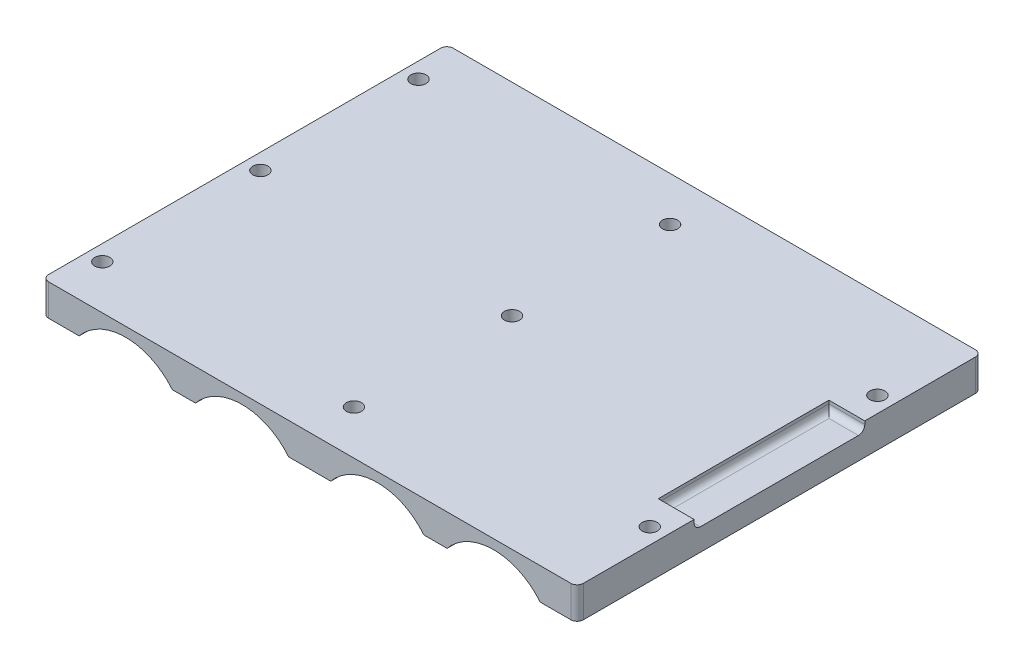
ISO-10303-21;
HEADER;
FILE_DESCRIPTION(('STEP AP214'),'2;1');
FILE_NAME('part.step','',(''),(''),'','','');
FILE_SCHEMA(('AUTOMOTIVE_DESIGN { 1 0 10303 214 1 1 1 1 }'));
ENDSEC;
DATA;
#1=APPLICATION_CONTEXT('core data for automotive mechanical design processes');
#2=APPLICATION_PROTOCOL_DEFINITION('international standard','automotive_design',2000,#1);
#3=PRODUCT_CONTEXT('',#1,'mechanical');
#4=PRODUCT('Part','Part','',(#3));
#5=PRODUCT_RELATED_PRODUCT_CATEGORY('part','',(#4));
#6=PRODUCT_DEFINITION_FORMATION('','',#4);
#7=PRODUCT_DEFINITION_CONTEXT('part definition',#1,'design');
#8=PRODUCT_DEFINITION('design','',#6,#7);
#9=PRODUCT_DEFINITION_SHAPE('','',#8);
#10=(LENGTH_UNIT() NAMED_UNIT(*) SI_UNIT(.MILLI.,.METRE.));
#11=(NAMED_UNIT(*) PLANE_ANGLE_UNIT() SI_UNIT($,.RADIAN.));
#12=(NAMED_UNIT(*) SI_UNIT($,.STERADIAN.) SOLID_ANGLE_UNIT());
#13=UNCERTAINTY_MEASURE_WITH_UNIT(LENGTH_MEASURE(1.E-05),#10,'distance_accuracy_value','');
#14=(GEOMETRIC_REPRESENTATION_CONTEXT(3) GLOBAL_UNCERTAINTY_ASSIGNED_CONTEXT((#13)) GLOBAL_UNIT_ASSIGNED_CONTEXT((#10,
#11,#12)) REPRESENTATION_CONTEXT('',''));
#15=CARTESIAN_POINT('',(0.,0.,0.));
#16=DIRECTION('',(0.,0.,1.));
#17=DIRECTION('',(1.,0.,0.));
#18=AXIS2_PLACEMENT_3D('',#15,#16,#17);
#19=CARTESIAN_POINT('',(3.33454006867188,-5.,32.));
#20=DIRECTION('',(0.,-1.,0.));
#21=DIRECTION('',(1.,0.,0.));
#22=AXIS2_PLACEMENT_3D('',#19,#20,#21);
#23=PLANE('',#22);
#24=CARTESIAN_POINT('',(0.,-5.,-25.));
#25=DIRECTION('',(0.,-1.,0.));
#26=DIRECTION('',(0.,0.,-1.));
#27=AXIS2_PLACEMENT_3D('',#24,#25,#26);
#28=CIRCLE('',#27,1.2);
#29=CARTESIAN_POINT('',(0.,-5.,-26.2));
#30=VERTEX_POINT('',#29);
#31=EDGE_CURVE('E216',#30,#30,#28,.T.);
#32=ORIENTED_EDGE('',*,*,#31,.F.);
#33=EDGE_LOOP('',(#32));
#34=FACE_BOUND('',#33,.T.);
#35=CARTESIAN_POINT('',(0.,-5.,0.));
#36=DIRECTION('',(0.,-1.,0.));
#37=DIRECTION('',(0.,0.,-1.));
#38=AXIS2_PLACEMENT_3D('',#35,#36,#37);
#39=CIRCLE('',#38,1.2);
#40=CARTESIAN_POINT('',(0.,-5.,-1.2));
#41=VERTEX_POINT('',#40);
#42=EDGE_CURVE('E224',#41,#41,#39,.T.);
#43=ORIENTED_EDGE('',*,*,#42,.F.);
#44=EDGE_LOOP('',(#43));
#45=FACE_BOUND('',#44,.T.);
#46=CARTESIAN_POINT('',(0.,-5.,25.));
#47=DIRECTION('',(0.,-1.,0.));
#48=DIRECTION('',(0.,0.,-1.));
#49=AXIS2_PLACEMENT_3D('',#46,#47,#48);
#50=CIRCLE('',#49,1.2);
#51=CARTESIAN_POINT('',(0.,-5.,23.8));
#52=VERTEX_POINT('',#51);
#53=EDGE_CURVE('E230',#52,#52,#50,.T.);
#54=ORIENTED_EDGE('',*,*,#53,.F.);
#55=EDGE_LOOP('',(#54));
#56=FACE_BOUND('',#55,.T.);
#57=DIRECTION('',(-1.,0.,0.));
#58=VECTOR('',#57,1.);
#59=CARTESIAN_POINT('',(3.33454006867188,-5.,-32.));
#60=LINE('',#59,#58);
#61=CARTESIAN_POINT('',(3.33454006867188,-5.,-32.));
#62=VERTEX_POINT('',#61);
#63=CARTESIAN_POINT('',(-3.33454006867188,-5.,-32.));
#64=VERTEX_POINT('',#63);
#65=EDGE_CURVE('E266',#62,#64,#60,.T.);
#66=ORIENTED_EDGE('',*,*,#65,.F.);
#67=DIRECTION('',(0.,0.,-1.));
#68=VECTOR('',#67,1.);
#69=CARTESIAN_POINT('',(3.33454006867188,-5.,32.));
#70=LINE('',#69,#68);
#71=CARTESIAN_POINT('',(3.33454006867188,-5.,32.));
#72=VERTEX_POINT('',#71);
#73=EDGE_CURVE('E321',#72,#62,#70,.T.);
#74=ORIENTED_EDGE('',*,*,#73,.F.);
#75=DIRECTION('',(-1.,0.,0.));
#76=VECTOR('',#75,1.);
#77=CARTESIAN_POINT('',(3.33454006867188,-5.,32.));
#78=LINE('',#77,#76);
#79=CARTESIAN_POINT('',(-3.33454006867188,-5.,32.));
#80=VERTEX_POINT('',#79);
#81=EDGE_CURVE('E267',#72,#80,#78,.T.);
#82=ORIENTED_EDGE('',*,*,#81,.T.);
#83=DIRECTION('',(0.,0.,-1.));
#84=VECTOR('',#83,1.);
#85=CARTESIAN_POINT('',(-3.33454006867188,-5.,32.));
#86=LINE('',#85,#84);
#87=EDGE_CURVE('E295',#80,#64,#86,.T.);
#88=ORIENTED_EDGE('',*,*,#87,.T.);
#89=EDGE_LOOP('',(#66,#74,#82,#88));
#90=FACE_BOUND('',#89,.T.);
#91=ADVANCED_FACE('F34',(#34,#45,#56,#90),#23,.T.);
#92=CARTESIAN_POINT('',(10.7,-11.,32.));
#93=DIRECTION('',(0.,0.,-1.));
#94=DIRECTION('',(-1.,0.,0.));
#95=AXIS2_PLACEMENT_3D('',#92,#93,#94);
#96=CYLINDRICAL_SURFACE('',#95,9.5);
#97=CARTESIAN_POINT('',(10.7,-11.,-32.));
#98=DIRECTION('',(0.,0.,-1.));
#99=DIRECTION('',(-1.,0.,0.));
#100=AXIS2_PLACEMENT_3D('',#97,#98,#99);
#101=CIRCLE('',#100,9.5);
#102=CARTESIAN_POINT('',(18.0654599313281,-5.,-32.));
#103=VERTEX_POINT('',#102);
#104=EDGE_CURVE('E271',#62,#103,#101,.T.);
#105=ORIENTED_EDGE('',*,*,#104,.T.);
#106=DIRECTION('',(0.,0.,-1.));
#107=VECTOR('',#106,1.);
#108=CARTESIAN_POINT('',(18.0654599313281,-5.,32.));
#109=LINE('',#108,#107);
#110=CARTESIAN_POINT('',(18.0654599313281,-5.,32.));
#111=VERTEX_POINT('',#110);
#112=EDGE_CURVE('E324',#111,#103,#109,.T.);
#113=ORIENTED_EDGE('',*,*,#112,.F.);
#114=CARTESIAN_POINT('',(10.7,-11.,32.));
#115=DIRECTION('',(0.,0.,-1.));
#116=DIRECTION('',(-1.,0.,0.));
#117=AXIS2_PLACEMENT_3D('',#114,#115,#116);
#118=CIRCLE('',#117,9.5);
#119=EDGE_CURVE('E293',#72,#111,#118,.T.);
#120=ORIENTED_EDGE('',*,*,#119,.F.);
#121=ORIENTED_EDGE('',*,*,#73,.T.);
#122=EDGE_LOOP('',(#105,#113,#120,#121));
#123=FACE_BOUND('',#122,.T.);
#124=ADVANCED_FACE('F422',(#123),#96,.F.);
#125=CARTESIAN_POINT('',(18.0654599313281,-5.,32.));
#126=DIRECTION('',(0.,1.,0.));
#127=DIRECTION('',(-1.,0.,0.));
#128=AXIS2_PLACEMENT_3D('',#125,#126,#127);
#129=PLANE('',#128);
#130=DIRECTION('',(1.,0.,0.));
#131=VECTOR('',#130,1.);
#132=CARTESIAN_POINT('',(18.0654599313281,-5.,-32.));
#133=LINE('',#132,#131);
#134=CARTESIAN_POINT('',(21.7345400686719,-5.,-32.));
#135=VERTEX_POINT('',#134);
#136=EDGE_CURVE('E318',#103,#135,#133,.T.);
#137=ORIENTED_EDGE('',*,*,#136,.T.);
#138=DIRECTION('',(0.,0.,-1.));
#139=VECTOR('',#138,1.);
#140=CARTESIAN_POINT('',(21.7345400686719,-5.,32.));
#141=LINE('',#140,#139);
#142=CARTESIAN_POINT('',(21.7345400686719,-5.,32.));
#143=VERTEX_POINT('',#142);
#144=EDGE_CURVE('E327',#143,#135,#141,.T.);
#145=ORIENTED_EDGE('',*,*,#144,.F.);
#146=DIRECTION('',(1.,0.,0.));
#147=VECTOR('',#146,1.);
#148=CARTESIAN_POINT('',(18.0654599313281,-5.,32.));
#149=LINE('',#148,#147);
#150=EDGE_CURVE('E291',#111,#143,#149,.T.);
#151=ORIENTED_EDGE('',*,*,#150,.F.);
#152=ORIENTED_EDGE('',*,*,#112,.T.);
#153=EDGE_LOOP('',(#137,#145,#151,#152));
#154=FACE_BOUND('',#153,.T.);
#155=ADVANCED_FACE('F428',(#154),#129,.F.);
#156=CARTESIAN_POINT('',(29.1,-11.,32.));
#157=DIRECTION('',(0.,0.,-1.));
#158=DIRECTION('',(-1.,0.,0.));
#159=AXIS2_PLACEMENT_3D('',#156,#157,#158);
#160=CYLINDRICAL_SURFACE('',#159,9.5);
#161=CARTESIAN_POINT('',(29.1,-11.,-32.));
#162=DIRECTION('',(0.,0.,-1.));
#163=DIRECTION('',(-1.,0.,0.));
#164=AXIS2_PLACEMENT_3D('',#161,#162,#163);
#165=CIRCLE('',#164,9.5);
#166=CARTESIAN_POINT('',(36.4654599313281,-5.,-32.));
#167=VERTEX_POINT('',#166);
#168=EDGE_CURVE('E316',#135,#167,#165,.T.);
#169=ORIENTED_EDGE('',*,*,#168,.T.);
#170=DIRECTION('',(0.,0.,-1.));
#171=VECTOR('',#170,1.);
#172=CARTESIAN_POINT('',(36.4654599313281,-5.,32.));
#173=LINE('',#172,#171);
#174=CARTESIAN_POINT('',(36.4654599313281,-5.,32.));
#175=VERTEX_POINT('',#174);
#176=EDGE_CURVE('E330',#175,#167,#173,.T.);
#177=ORIENTED_EDGE('',*,*,#176,.F.);
#178=CARTESIAN_POINT('',(29.1,-11.,32.));
#179=DIRECTION('',(0.,0.,-1.));
#180=DIRECTION('',(-1.,0.,0.));
#181=AXIS2_PLACEMENT_3D('',#178,#179,#180);
#182=CIRCLE('',#181,9.5);
#183=EDGE_CURVE('E289',#143,#175,#182,.T.);
#184=ORIENTED_EDGE('',*,*,#183,.F.);
#185=ORIENTED_EDGE('',*,*,#144,.T.);
#186=EDGE_LOOP('',(#169,#177,#184,#185));
#187=FACE_BOUND('',#186,.T.);
#188=ADVANCED_FACE('F472',(#187),#160,.F.);
#189=CARTESIAN_POINT('',(36.4654599313281,-5.,32.));
#190=DIRECTION('',(0.,1.,0.));
#191=DIRECTION('',(-1.,0.,0.));
#192=AXIS2_PLACEMENT_3D('',#189,#190,#191);
#193=PLANE('',#192);
#194=CARTESIAN_POINT('',(39.8,-5.,18.));
#195=DIRECTION('',(0.,-1.,0.));
#196=DIRECTION('',(0.,0.,-1.));
#197=AXIS2_PLACEMENT_3D('',#194,#195,#196);
#198=CIRCLE('',#197,1.2);
#199=CARTESIAN_POINT('',(39.8,-5.,16.8));
#200=VERTEX_POINT('',#199);
#201=EDGE_CURVE('E254',#200,#200,#198,.T.);
#202=ORIENTED_EDGE('',*,*,#201,.F.);
#203=EDGE_LOOP('',(#202));
#204=FACE_BOUND('',#203,.T.);
#205=CARTESIAN_POINT('',(39.8,-5.,-18.));
#206=DIRECTION('',(0.,-1.,0.));
#207=DIRECTION('',(0.,0.,-1.));
#208=AXIS2_PLACEMENT_3D('',#205,#206,#207);
#209=CIRCLE('',#208,1.2);
#210=CARTESIAN_POINT('',(39.8,-5.,-19.2));
#211=VERTEX_POINT('',#210);
#212=EDGE_CURVE('E260',#211,#211,#209,.T.);
#213=ORIENTED_EDGE('',*,*,#212,.F.);
#214=EDGE_LOOP('',(#213));
#215=FACE_BOUND('',#214,.T.);
#216=DIRECTION('',(1.,0.,0.));
#217=VECTOR('',#216,1.);
#218=CARTESIAN_POINT('',(36.4654599313281,-5.,-32.));
#219=LINE('',#218,#217);
#220=CARTESIAN_POINT('',(41.3,-5.,-32.));
#221=VERTEX_POINT('',#220);
#222=EDGE_CURVE('E313',#167,#221,#219,.T.);
#223=ORIENTED_EDGE('',*,*,#222,.T.);
#224=CARTESIAN_POINT('',(41.3,-5.,-31.));
#225=DIRECTION('',(0.,1.,0.));
#226=DIRECTION('',(-1.,0.,0.));
#227=AXIS2_PLACEMENT_3D('',#224,#225,#226);
#228=CIRCLE('',#227,1.);
#229=CARTESIAN_POINT('',(42.3,-5.,-31.));
#230=VERTEX_POINT('',#229);
#231=EDGE_CURVE('E380',#221,#230,#228,.F.);
#232=ORIENTED_EDGE('',*,*,#231,.T.);
#233=DIRECTION('',(0.,0.,-1.));
#234=VECTOR('',#233,1.);
#235=CARTESIAN_POINT('',(42.3,-5.,32.));
#236=LINE('',#235,#234);
#237=CARTESIAN_POINT('',(42.3,-5.,31.));
#238=VERTEX_POINT('',#237);
#239=EDGE_CURVE('E333',#238,#230,#236,.T.);
#240=ORIENTED_EDGE('',*,*,#239,.F.);
#241=CARTESIAN_POINT('',(41.3,-5.,31.));
#242=DIRECTION('',(0.,1.,0.));
#243=DIRECTION('',(-1.,0.,0.));
#244=AXIS2_PLACEMENT_3D('',#241,#242,#243);
#245=CIRCLE('',#244,1.);
#246=CARTESIAN_POINT('',(41.3,-5.,32.));
#247=VERTEX_POINT('',#246);
#248=EDGE_CURVE('E378',#238,#247,#245,.F.);
#249=ORIENTED_EDGE('',*,*,#248,.T.);
#250=DIRECTION('',(1.,0.,0.));
#251=VECTOR('',#250,1.);
#252=CARTESIAN_POINT('',(36.4654599313281,-5.,32.));
#253=LINE('',#252,#251);
#254=EDGE_CURVE('E286',#175,#247,#253,.T.);
#255=ORIENTED_EDGE('',*,*,#254,.F.);
#256=ORIENTED_EDGE('',*,*,#176,.T.);
#257=EDGE_LOOP('',(#223,#232,#240,#249,#255,#256));
#258=FACE_BOUND('',#257,.T.);
#259=ADVANCED_FACE('F463',(#204,#215,#258),#193,.F.);
#260=CARTESIAN_POINT('',(42.3,-5.,32.));
#261=DIRECTION('',(-1.,0.,0.));
#262=DIRECTION('',(0.,0.,1.));
#263=AXIS2_PLACEMENT_3D('',#260,#261,#262);
#264=PLANE('',#263);
#265=DIRECTION('',(0.,0.,-1.));
#266=VECTOR('',#265,1.);
#267=CARTESIAN_POINT('',(42.3,-1.5,13.5));
#268=LINE('',#267,#266);
#269=CARTESIAN_POINT('',(42.3,-1.5,12.5));
#270=VERTEX_POINT('',#269);
#271=CARTESIAN_POINT('',(42.3,-1.5,-12.5));
#272=VERTEX_POINT('',#271);
#273=EDGE_CURVE('E210',#270,#272,#268,.T.);
#274=ORIENTED_EDGE('',*,*,#273,.F.);
#275=CARTESIAN_POINT('',(42.3,-0.5,12.5));
#276=DIRECTION('',(-1.,0.,0.));
#277=DIRECTION('',(0.,0.,1.));
#278=AXIS2_PLACEMENT_3D('',#275,#276,#277);
#279=CIRCLE('',#278,1.);
#280=CARTESIAN_POINT('',(42.3,-0.5,13.5));
#281=VERTEX_POINT('',#280);
#282=EDGE_CURVE('E11',#270,#281,#279,.T.);
#283=ORIENTED_EDGE('',*,*,#282,.T.);
#284=DIRECTION('',(0.,1.,0.));
#285=VECTOR('',#284,1.);
#286=CARTESIAN_POINT('',(42.3,-1.5,13.5));
#287=LINE('',#286,#285);
#288=CARTESIAN_POINT('',(42.3,0.,13.5));
#289=VERTEX_POINT('',#288);
#290=EDGE_CURVE('E214',#281,#289,#287,.T.);
#291=ORIENTED_EDGE('',*,*,#290,.T.);
#292=DIRECTION('',(0.,0.,-1.));
#293=VECTOR('',#292,1.);
#294=CARTESIAN_POINT('',(42.3,0.,32.));
#295=LINE('',#294,#293);
#296=CARTESIAN_POINT('',(42.3,0.,31.));
#297=VERTEX_POINT('',#296);
#298=EDGE_CURVE('E336',#297,#289,#295,.T.);
#299=ORIENTED_EDGE('',*,*,#298,.F.);
#300=DIRECTION('',(0.,1.,0.));
#301=VECTOR('',#300,1.);
#302=CARTESIAN_POINT('',(42.3,-5.,31.));
#303=LINE('',#302,#301);
#304=EDGE_CURVE('E373',#297,#238,#303,.F.);
#305=ORIENTED_EDGE('',*,*,#304,.T.);
#306=ORIENTED_EDGE('',*,*,#239,.T.);
#307=DIRECTION('',(0.,1.,0.));
#308=VECTOR('',#307,1.);
#309=CARTESIAN_POINT('',(42.3,-5.,-31.));
#310=LINE('',#309,#308);
#311=CARTESIAN_POINT('',(42.3,0.,-31.));
#312=VERTEX_POINT('',#311);
#313=EDGE_CURVE('E375',#230,#312,#310,.T.);
#314=ORIENTED_EDGE('',*,*,#313,.T.);
#315=CARTESIAN_POINT('',(42.3,0.,-13.5));
#316=VERTEX_POINT('',#315);
#317=EDGE_CURVE('E338',#316,#312,#295,.T.);
#318=ORIENTED_EDGE('',*,*,#317,.F.);
#319=DIRECTION('',(0.,1.,0.));
#320=VECTOR('',#319,1.);
#321=CARTESIAN_POINT('',(42.3,-1.5,-13.5));
#322=LINE('',#321,#320);
#323=CARTESIAN_POINT('',(42.3,-0.5,-13.5));
#324=VERTEX_POINT('',#323);
#325=EDGE_CURVE('E195',#324,#316,#322,.T.);
#326=ORIENTED_EDGE('',*,*,#325,.F.);
#327=CARTESIAN_POINT('',(42.3,-0.5,-12.5));
#328=DIRECTION('',(-1.,0.,0.));
#329=DIRECTION('',(0.,0.,1.));
#330=AXIS2_PLACEMENT_3D('',#327,#328,#329);
#331=CIRCLE('',#330,1.);
#332=EDGE_CURVE('E43',#324,#272,#331,.T.);
#333=ORIENTED_EDGE('',*,*,#332,.T.);
#334=EDGE_LOOP('',(#274,#283,#291,#299,#305,#306,#314,#318,#326,#333));
#335=FACE_BOUND('',#334,.T.);
#336=ADVANCED_FACE('F412',(#335),#264,.F.);
#337=CARTESIAN_POINT('',(-42.3,0.,32.));
#338=DIRECTION('',(0.,1.,0.));
#339=DIRECTION('',(0.,0.,1.));
#340=AXIS2_PLACEMENT_3D('',#337,#338,#339);
#341=PLANE('',#340);
#342=DIRECTION('',(1.,0.,0.));
#343=VECTOR('',#342,1.);
#344=CARTESIAN_POINT('',(42.3,0.,13.5));
#345=LINE('',#344,#343);
#346=CARTESIAN_POINT('',(36.63,0.,13.5));
#347=VERTEX_POINT('',#346);
#348=EDGE_CURVE('E208',#347,#289,#345,.T.);
#349=ORIENTED_EDGE('',*,*,#348,.F.);
#350=DIRECTION('',(0.,0.,1.));
#351=VECTOR('',#350,1.);
#352=CARTESIAN_POINT('',(36.63,0.,13.5));
#353=LINE('',#352,#351);
#354=CARTESIAN_POINT('',(36.63,0.,-13.5));
#355=VERTEX_POINT('',#354);
#356=EDGE_CURVE('E188',#355,#347,#353,.T.);
#357=ORIENTED_EDGE('',*,*,#356,.F.);
#358=DIRECTION('',(-1.,0.,0.));
#359=VECTOR('',#358,1.);
#360=CARTESIAN_POINT('',(42.3,0.,-13.5));
#361=LINE('',#360,#359);
#362=EDGE_CURVE('E198',#316,#355,#361,.T.);
#363=ORIENTED_EDGE('',*,*,#362,.F.);
#364=ORIENTED_EDGE('',*,*,#317,.T.);
#365=CARTESIAN_POINT('',(41.3,0.,-31.));
#366=DIRECTION('',(0.,1.,0.));
#367=DIRECTION('',(0.,0.,1.));
#368=AXIS2_PLACEMENT_3D('',#365,#366,#367);
#369=CIRCLE('',#368,1.);
#370=CARTESIAN_POINT('',(41.3,0.,-32.));
#371=VERTEX_POINT('',#370);
#372=EDGE_CURVE('E360',#312,#371,#369,.T.);
#373=ORIENTED_EDGE('',*,*,#372,.T.);
#374=DIRECTION('',(1.,0.,0.));
#375=VECTOR('',#374,1.);
#376=CARTESIAN_POINT('',(-42.3,0.,-32.));
#377=LINE('',#376,#375);
#378=CARTESIAN_POINT('',(-41.3,0.,-32.));
#379=VERTEX_POINT('',#378);
#380=EDGE_CURVE('E310',#379,#371,#377,.T.);
#381=ORIENTED_EDGE('',*,*,#380,.F.);
#382=CARTESIAN_POINT('',(-41.3,0.,-31.));
#383=DIRECTION('',(0.,1.,0.));
#384=DIRECTION('',(0.,0.,1.));
#385=AXIS2_PLACEMENT_3D('',#382,#383,#384);
#386=CIRCLE('',#385,1.);
#387=CARTESIAN_POINT('',(-42.3,0.,-31.));
#388=VERTEX_POINT('',#387);
#389=EDGE_CURVE('E362',#379,#388,#386,.T.);
#390=ORIENTED_EDGE('',*,*,#389,.T.);
#391=DIRECTION('',(0.,0.,-1.));
#392=VECTOR('',#391,1.);
#393=CARTESIAN_POINT('',(-42.3,0.,32.));
#394=LINE('',#393,#392);
#395=CARTESIAN_POINT('',(-42.3,0.,31.));
#396=VERTEX_POINT('',#395);
#397=EDGE_CURVE('E339',#396,#388,#394,.T.);
#398=ORIENTED_EDGE('',*,*,#397,.F.);
#399=CARTESIAN_POINT('',(-41.3,0.,31.));
#400=DIRECTION('',(0.,1.,0.));
#401=DIRECTION('',(0.,0.,1.));
#402=AXIS2_PLACEMENT_3D('',#399,#400,#401);
#403=CIRCLE('',#402,1.);
#404=CARTESIAN_POINT('',(-41.3,0.,32.));
#405=VERTEX_POINT('',#404);
#406=EDGE_CURVE('E358',#396,#405,#403,.T.);
#407=ORIENTED_EDGE('',*,*,#406,.T.);
#408=DIRECTION('',(1.,0.,0.));
#409=VECTOR('',#408,1.);
#410=CARTESIAN_POINT('',(-42.3,0.,32.));
#411=LINE('',#410,#409);
#412=CARTESIAN_POINT('',(41.3,0.,32.));
#413=VERTEX_POINT('',#412);
#414=EDGE_CURVE('E283',#405,#413,#411,.T.);
#415=ORIENTED_EDGE('',*,*,#414,.T.);
#416=CARTESIAN_POINT('',(41.3,0.,31.));
#417=DIRECTION('',(0.,1.,0.));
#418=DIRECTION('',(0.,0.,1.));
#419=AXIS2_PLACEMENT_3D('',#416,#417,#418);
#420=CIRCLE('',#419,1.);
#421=EDGE_CURVE('E356',#413,#297,#420,.T.);
#422=ORIENTED_EDGE('',*,*,#421,.T.);
#423=ORIENTED_EDGE('',*,*,#298,.T.);
#424=EDGE_LOOP('',(#349,#357,#363,#364,#373,#381,#390,#398,#407,#415,#422,#423));
#425=FACE_BOUND('',#424,.T.);
#426=CARTESIAN_POINT('',(0.,0.,-25.));
#427=DIRECTION('',(0.,-1.,0.));
#428=DIRECTION('',(0.,0.,-1.));
#429=AXIS2_PLACEMENT_3D('',#426,#427,#428);
#430=CIRCLE('',#429,1.2);
#431=CARTESIAN_POINT('',(0.,0.,-26.2));
#432=VERTEX_POINT('',#431);
#433=EDGE_CURVE('E221',#432,#432,#430,.T.);
#434=ORIENTED_EDGE('',*,*,#433,.T.);
#435=EDGE_LOOP('',(#434));
#436=FACE_BOUND('',#435,.T.);
#437=CARTESIAN_POINT('',(0.,0.,0.));
#438=DIRECTION('',(0.,-1.,0.));
#439=DIRECTION('',(0.,0.,-1.));
#440=AXIS2_PLACEMENT_3D('',#437,#438,#439);
#441=CIRCLE('',#440,1.2);
#442=CARTESIAN_POINT('',(0.,0.,-1.2));
#443=VERTEX_POINT('',#442);
#444=EDGE_CURVE('E227',#443,#443,#441,.T.);
#445=ORIENTED_EDGE('',*,*,#444,.T.);
#446=EDGE_LOOP('',(#445));
#447=FACE_BOUND('',#446,.T.);
#448=CARTESIAN_POINT('',(0.,0.,25.));
#449=DIRECTION('',(0.,-1.,0.));
#450=DIRECTION('',(0.,0.,-1.));
#451=AXIS2_PLACEMENT_3D('',#448,#449,#450);
#452=CIRCLE('',#451,1.2);
#453=CARTESIAN_POINT('',(0.,0.,23.8));
#454=VERTEX_POINT('',#453);
#455=EDGE_CURVE('E233',#454,#454,#452,.T.);
#456=ORIENTED_EDGE('',*,*,#455,.T.);
#457=EDGE_LOOP('',(#456));
#458=FACE_BOUND('',#457,.T.);
#459=CARTESIAN_POINT('',(-39.8,0.,25.));
#460=DIRECTION('',(0.,-1.,0.));
#461=DIRECTION('',(0.,0.,-1.));
#462=AXIS2_PLACEMENT_3D('',#459,#460,#461);
#463=CIRCLE('',#462,1.2);
#464=CARTESIAN_POINT('',(-39.8,0.,23.8));
#465=VERTEX_POINT('',#464);
#466=EDGE_CURVE('E239',#465,#465,#463,.T.);
#467=ORIENTED_EDGE('',*,*,#466,.T.);
#468=EDGE_LOOP('',(#467));
#469=FACE_BOUND('',#468,.T.);
#470=CARTESIAN_POINT('',(-39.8,0.,0.));
#471=DIRECTION('',(0.,-1.,0.));
#472=DIRECTION('',(0.,0.,-1.));
#473=AXIS2_PLACEMENT_3D('',#470,#471,#472);
#474=CIRCLE('',#473,1.2);
#475=CARTESIAN_POINT('',(-39.8,0.,-1.2));
#476=VERTEX_POINT('',#475);
#477=EDGE_CURVE('E245',#476,#476,#474,.T.);
#478=ORIENTED_EDGE('',*,*,#477,.T.);
#479=EDGE_LOOP('',(#478));
#480=FACE_BOUND('',#479,.T.);
#481=CARTESIAN_POINT('',(-39.8,0.,-25.));
#482=DIRECTION('',(0.,-1.,0.));
#483=DIRECTION('',(0.,0.,-1.));
#484=AXIS2_PLACEMENT_3D('',#481,#482,#483);
#485=CIRCLE('',#484,1.2);
#486=CARTESIAN_POINT('',(-39.8,0.,-26.2));
#487=VERTEX_POINT('',#486);
#488=EDGE_CURVE('E251',#487,#487,#485,.T.);
#489=ORIENTED_EDGE('',*,*,#488,.T.);
#490=EDGE_LOOP('',(#489));
#491=FACE_BOUND('',#490,.T.);
#492=CARTESIAN_POINT('',(39.8,0.,18.));
#493=DIRECTION('',(0.,-1.,0.));
#494=DIRECTION('',(0.,0.,-1.));
#495=AXIS2_PLACEMENT_3D('',#492,#493,#494);
#496=CIRCLE('',#495,1.2);
#497=CARTESIAN_POINT('',(39.8,0.,16.8));
#498=VERTEX_POINT('',#497);
#499=EDGE_CURVE('E257',#498,#498,#496,.T.);
#500=ORIENTED_EDGE('',*,*,#499,.T.);
#501=EDGE_LOOP('',(#500));
#502=FACE_BOUND('',#501,.T.);
#503=CARTESIAN_POINT('',(39.8,0.,-18.));
#504=DIRECTION('',(0.,-1.,0.));
#505=DIRECTION('',(0.,0.,-1.));
#506=AXIS2_PLACEMENT_3D('',#503,#504,#505);
#507=CIRCLE('',#506,1.2);
#508=CARTESIAN_POINT('',(39.8,0.,-19.2));
#509=VERTEX_POINT('',#508);
#510=EDGE_CURVE('E263',#509,#509,#507,.T.);
#511=ORIENTED_EDGE('',*,*,#510,.T.);
#512=EDGE_LOOP('',(#511));
#513=FACE_BOUND('',#512,.T.);
#514=ADVANCED_FACE('F204',(#425,#436,#447,#458,#469,#480,#491,#502,#513),#341,.T.);
#515=CARTESIAN_POINT('',(-42.3,-5.,32.));
#516=DIRECTION('',(-1.,0.,0.));
#517=DIRECTION('',(0.,0.,1.));
#518=AXIS2_PLACEMENT_3D('',#515,#516,#517);
#519=PLANE('',#518);
#520=ORIENTED_EDGE('',*,*,#397,.T.);
#521=DIRECTION('',(0.,1.,0.));
#522=VECTOR('',#521,1.);
#523=CARTESIAN_POINT('',(-42.3,-5.,-31.));
#524=LINE('',#523,#522);
#525=CARTESIAN_POINT('',(-42.3,-5.,-31.));
#526=VERTEX_POINT('',#525);
#527=EDGE_CURVE('E367',#388,#526,#524,.F.);
#528=ORIENTED_EDGE('',*,*,#527,.T.);
#529=DIRECTION('',(0.,0.,-1.));
#530=VECTOR('',#529,1.);
#531=CARTESIAN_POINT('',(-42.3,-5.,32.));
#532=LINE('',#531,#530);
#533=CARTESIAN_POINT('',(-42.3,-5.,31.));
#534=VERTEX_POINT('',#533);
#535=EDGE_CURVE('E342',#534,#526,#532,.T.);
#536=ORIENTED_EDGE('',*,*,#535,.F.);
#537=DIRECTION('',(0.,1.,0.));
#538=VECTOR('',#537,1.);
#539=CARTESIAN_POINT('',(-42.3,-5.,31.));
#540=LINE('',#539,#538);
#541=EDGE_CURVE('E364',#534,#396,#540,.T.);
#542=ORIENTED_EDGE('',*,*,#541,.T.);
#543=EDGE_LOOP('',(#520,#528,#536,#542));
#544=FACE_BOUND('',#543,.T.);
#545=ADVANCED_FACE('F494',(#544),#519,.T.);
#546=CARTESIAN_POINT('',(-36.4654599313281,-5.,32.));
#547=DIRECTION('',(0.,-1.,0.));
#548=DIRECTION('',(1.,0.,0.));
#549=AXIS2_PLACEMENT_3D('',#546,#547,#548);
#550=PLANE('',#549);
#551=CARTESIAN_POINT('',(-39.8,-5.,25.));
#552=DIRECTION('',(0.,-1.,0.));
#553=DIRECTION('',(0.,0.,-1.));
#554=AXIS2_PLACEMENT_3D('',#551,#552,#553);
#555=CIRCLE('',#554,1.2);
#556=CARTESIAN_POINT('',(-39.8,-5.,23.8));
#557=VERTEX_POINT('',#556);
#558=EDGE_CURVE('E236',#557,#557,#555,.T.);
#559=ORIENTED_EDGE('',*,*,#558,.F.);
#560=EDGE_LOOP('',(#559));
#561=FACE_BOUND('',#560,.T.);
#562=CARTESIAN_POINT('',(-39.8,-5.,0.));
#563=DIRECTION('',(0.,-1.,0.));
#564=DIRECTION('',(0.,0.,-1.));
#565=AXIS2_PLACEMENT_3D('',#562,#563,#564);
#566=CIRCLE('',#565,1.2);
#567=CARTESIAN_POINT('',(-39.8,-5.,-1.2));
#568=VERTEX_POINT('',#567);
#569=EDGE_CURVE('E242',#568,#568,#566,.T.);
#570=ORIENTED_EDGE('',*,*,#569,.F.);
#571=EDGE_LOOP('',(#570));
#572=FACE_BOUND('',#571,.T.);
#573=CARTESIAN_POINT('',(-39.8,-5.,-25.));
#574=DIRECTION('',(0.,-1.,0.));
#575=DIRECTION('',(0.,0.,-1.));
#576=AXIS2_PLACEMENT_3D('',#573,#574,#575);
#577=CIRCLE('',#576,1.2);
#578=CARTESIAN_POINT('',(-39.8,-5.,-26.2));
#579=VERTEX_POINT('',#578);
#580=EDGE_CURVE('E248',#579,#579,#577,.T.);
#581=ORIENTED_EDGE('',*,*,#580,.F.);
#582=EDGE_LOOP('',(#581));
#583=FACE_BOUND('',#582,.T.);
#584=ORIENTED_EDGE('',*,*,#535,.T.);
#585=CARTESIAN_POINT('',(-41.3,-5.,-31.));
#586=DIRECTION('',(0.,-1.,0.));
#587=DIRECTION('',(1.,0.,0.));
#588=AXIS2_PLACEMENT_3D('',#585,#586,#587);
#589=CIRCLE('',#588,1.);
#590=CARTESIAN_POINT('',(-41.3,-5.,-32.));
#591=VERTEX_POINT('',#590);
#592=EDGE_CURVE('E371',#526,#591,#589,.T.);
#593=ORIENTED_EDGE('',*,*,#592,.T.);
#594=DIRECTION('',(-1.,0.,0.));
#595=VECTOR('',#594,1.);
#596=CARTESIAN_POINT('',(-36.4654599313281,-5.,-32.));
#597=LINE('',#596,#595);
#598=CARTESIAN_POINT('',(-36.4654599313281,-5.,-32.));
#599=VERTEX_POINT('',#598);
#600=EDGE_CURVE('E307',#599,#591,#597,.T.);
#601=ORIENTED_EDGE('',*,*,#600,.F.);
#602=DIRECTION('',(0.,0.,-1.));
#603=VECTOR('',#602,1.);
#604=CARTESIAN_POINT('',(-36.4654599313281,-5.,32.));
#605=LINE('',#604,#603);
#606=CARTESIAN_POINT('',(-36.4654599313281,-5.,32.));
#607=VERTEX_POINT('',#606);
#608=EDGE_CURVE('E345',#607,#599,#605,.T.);
#609=ORIENTED_EDGE('',*,*,#608,.F.);
#610=DIRECTION('',(-1.,0.,0.));
#611=VECTOR('',#610,1.);
#612=CARTESIAN_POINT('',(-36.4654599313281,-5.,32.));
#613=LINE('',#612,#611);
#614=CARTESIAN_POINT('',(-41.3,-5.,32.));
#615=VERTEX_POINT('',#614);
#616=EDGE_CURVE('E280',#607,#615,#613,.T.);
#617=ORIENTED_EDGE('',*,*,#616,.T.);
#618=CARTESIAN_POINT('',(-41.3,-5.,31.));
#619=DIRECTION('',(0.,-1.,0.));
#620=DIRECTION('',(1.,0.,0.));
#621=AXIS2_PLACEMENT_3D('',#618,#619,#620);
#622=CIRCLE('',#621,1.);
#623=EDGE_CURVE('E369',#615,#534,#622,.T.);
#624=ORIENTED_EDGE('',*,*,#623,.T.);
#625=EDGE_LOOP('',(#584,#593,#601,#609,#617,#624));
#626=FACE_BOUND('',#625,.T.);
#627=ADVANCED_FACE('F491',(#561,#572,#583,#626),#550,.T.);
#628=CARTESIAN_POINT('',(-29.1,-11.,32.));
#629=DIRECTION('',(0.,0.,-1.));
#630=DIRECTION('',(-1.,0.,0.));
#631=AXIS2_PLACEMENT_3D('',#628,#629,#630);
#632=CYLINDRICAL_SURFACE('',#631,9.50000000000001);
#633=CARTESIAN_POINT('',(-29.1,-11.,-32.));
#634=DIRECTION('',(0.,0.,1.));
#635=DIRECTION('',(1.,0.,0.));
#636=AXIS2_PLACEMENT_3D('',#633,#634,#635);
#637=CIRCLE('',#636,9.50000000000001);
#638=CARTESIAN_POINT('',(-21.7345400686719,-5.,-32.));
#639=VERTEX_POINT('',#638);
#640=EDGE_CURVE('E304',#639,#599,#637,.T.);
#641=ORIENTED_EDGE('',*,*,#640,.F.);
#642=DIRECTION('',(0.,0.,-1.));
#643=VECTOR('',#642,1.);
#644=CARTESIAN_POINT('',(-21.7345400686719,-5.,32.));
#645=LINE('',#644,#643);
#646=CARTESIAN_POINT('',(-21.7345400686719,-5.,32.));
#647=VERTEX_POINT('',#646);
#648=EDGE_CURVE('E347',#647,#639,#645,.T.);
#649=ORIENTED_EDGE('',*,*,#648,.F.);
#650=CARTESIAN_POINT('',(-29.1,-11.,32.));
#651=DIRECTION('',(0.,0.,1.));
#652=DIRECTION('',(1.,0.,0.));
#653=AXIS2_PLACEMENT_3D('',#650,#651,#652);
#654=CIRCLE('',#653,9.50000000000001);
#655=EDGE_CURVE('E277',#647,#607,#654,.T.);
#656=ORIENTED_EDGE('',*,*,#655,.T.);
#657=ORIENTED_EDGE('',*,*,#608,.T.);
#658=EDGE_LOOP('',(#641,#649,#656,#657));
#659=FACE_BOUND('',#658,.T.);
#660=ADVANCED_FACE('F501',(#659),#632,.F.);
#661=CARTESIAN_POINT('',(-18.0654599313281,-5.,32.));
#662=DIRECTION('',(0.,-1.,0.));
#663=DIRECTION('',(1.,0.,0.));
#664=AXIS2_PLACEMENT_3D('',#661,#662,#663);
#665=PLANE('',#664);
#666=DIRECTION('',(-1.,0.,0.));
#667=VECTOR('',#666,1.);
#668=CARTESIAN_POINT('',(-18.0654599313281,-5.,-32.));
#669=LINE('',#668,#667);
#670=CARTESIAN_POINT('',(-18.0654599313281,-5.,-32.));
#671=VERTEX_POINT('',#670);
#672=EDGE_CURVE('E301',#671,#639,#669,.T.);
#673=ORIENTED_EDGE('',*,*,#672,.F.);
#674=DIRECTION('',(0.,0.,-1.));
#675=VECTOR('',#674,1.);
#676=CARTESIAN_POINT('',(-18.0654599313281,-5.,32.));
#677=LINE('',#676,#675);
#678=CARTESIAN_POINT('',(-18.0654599313281,-5.,32.));
#679=VERTEX_POINT('',#678);
#680=EDGE_CURVE('E349',#679,#671,#677,.T.);
#681=ORIENTED_EDGE('',*,*,#680,.F.);
#682=DIRECTION('',(-1.,0.,0.));
#683=VECTOR('',#682,1.);
#684=CARTESIAN_POINT('',(-18.0654599313281,-5.,32.));
#685=LINE('',#684,#683);
#686=EDGE_CURVE('E274',#679,#647,#685,.T.);
#687=ORIENTED_EDGE('',*,*,#686,.T.);
#688=ORIENTED_EDGE('',*,*,#648,.T.);
#689=EDGE_LOOP('',(#673,#681,#687,#688));
#690=FACE_BOUND('',#689,.T.);
#691=ADVANCED_FACE('F506',(#690),#665,.T.);
#692=CARTESIAN_POINT('',(-10.7,-11.,32.));
#693=DIRECTION('',(0.,0.,-1.));
#694=DIRECTION('',(-1.,0.,0.));
#695=AXIS2_PLACEMENT_3D('',#692,#693,#694);
#696=CYLINDRICAL_SURFACE('',#695,9.5);
#697=CARTESIAN_POINT('',(-10.7,-11.,-32.));
#698=DIRECTION('',(0.,0.,1.));
#699=DIRECTION('',(1.,0.,0.));
#700=AXIS2_PLACEMENT_3D('',#697,#698,#699);
#701=CIRCLE('',#700,9.5);
#702=EDGE_CURVE('E298',#64,#671,#701,.T.);
#703=ORIENTED_EDGE('',*,*,#702,.F.);
#704=ORIENTED_EDGE('',*,*,#87,.F.);
#705=CARTESIAN_POINT('',(-10.7,-11.,32.));
#706=DIRECTION('',(0.,0.,1.));
#707=DIRECTION('',(1.,0.,0.));
#708=AXIS2_PLACEMENT_3D('',#705,#706,#707);
#709=CIRCLE('',#708,9.5);
#710=EDGE_CURVE('E270',#80,#679,#709,.T.);
#711=ORIENTED_EDGE('',*,*,#710,.T.);
#712=ORIENTED_EDGE('',*,*,#680,.T.);
#713=EDGE_LOOP('',(#703,#704,#711,#712));
#714=FACE_BOUND('',#713,.T.);
#715=ADVANCED_FACE('F435',(#714),#696,.F.);
#716=CARTESIAN_POINT('',(-10.7,-11.,32.));
#717=DIRECTION('',(0.,0.,1.));
#718=DIRECTION('',(1.,0.,0.));
#719=AXIS2_PLACEMENT_3D('',#716,#717,#718);
#720=PLANE('',#719);
#721=ORIENTED_EDGE('',*,*,#414,.F.);
#722=DIRECTION('',(0.,1.,0.));
#723=VECTOR('',#722,1.);
#724=CARTESIAN_POINT('',(-41.3,-11.,32.));
#725=LINE('',#724,#723);
#726=EDGE_CURVE('E385',#405,#615,#725,.F.);
#727=ORIENTED_EDGE('',*,*,#726,.T.);
#728=ORIENTED_EDGE('',*,*,#616,.F.);
#729=ORIENTED_EDGE('',*,*,#655,.F.);
#730=ORIENTED_EDGE('',*,*,#686,.F.);
#731=ORIENTED_EDGE('',*,*,#710,.F.);
#732=ORIENTED_EDGE('',*,*,#81,.F.);
#733=ORIENTED_EDGE('',*,*,#119,.T.);
#734=ORIENTED_EDGE('',*,*,#150,.T.);
#735=ORIENTED_EDGE('',*,*,#183,.T.);
#736=ORIENTED_EDGE('',*,*,#254,.T.);
#737=DIRECTION('',(0.,1.,0.));
#738=VECTOR('',#737,1.);
#739=CARTESIAN_POINT('',(41.3,0.,32.));
#740=LINE('',#739,#738);
#741=EDGE_CURVE('E382',#247,#413,#740,.T.);
#742=ORIENTED_EDGE('',*,*,#741,.T.);
#743=EDGE_LOOP('',(#721,#727,#728,#729,#730,#731,#732,#733,#734,#735,#736,#742));
#744=FACE_BOUND('',#743,.T.);
#745=ADVANCED_FACE('F466',(#744),#720,.T.);
#746=CARTESIAN_POINT('',(-10.7,-11.,-32.));
#747=DIRECTION('',(0.,0.,1.));
#748=DIRECTION('',(1.,0.,0.));
#749=AXIS2_PLACEMENT_3D('',#746,#747,#748);
#750=PLANE('',#749);
#751=ORIENTED_EDGE('',*,*,#600,.T.);
#752=DIRECTION('',(0.,1.,0.));
#753=VECTOR('',#752,1.);
#754=CARTESIAN_POINT('',(-41.3,0.,-32.));
#755=LINE('',#754,#753);
#756=EDGE_CURVE('E353',#591,#379,#755,.T.);
#757=ORIENTED_EDGE('',*,*,#756,.T.);
#758=ORIENTED_EDGE('',*,*,#380,.T.);
#759=DIRECTION('',(0.,1.,0.));
#760=VECTOR('',#759,1.);
#761=CARTESIAN_POINT('',(41.3,-11.,-32.));
#762=LINE('',#761,#760);
#763=EDGE_CURVE('E323',#371,#221,#762,.F.);
#764=ORIENTED_EDGE('',*,*,#763,.T.);
#765=ORIENTED_EDGE('',*,*,#222,.F.);
#766=ORIENTED_EDGE('',*,*,#168,.F.);
#767=ORIENTED_EDGE('',*,*,#136,.F.);
#768=ORIENTED_EDGE('',*,*,#104,.F.);
#769=ORIENTED_EDGE('',*,*,#65,.T.);
#770=ORIENTED_EDGE('',*,*,#702,.T.);
#771=ORIENTED_EDGE('',*,*,#672,.T.);
#772=ORIENTED_EDGE('',*,*,#640,.T.);
#773=EDGE_LOOP('',(#751,#757,#758,#764,#765,#766,#767,#768,#769,#770,#771,#772));
#774=FACE_BOUND('',#773,.T.);
#775=ADVANCED_FACE('F477',(#774),#750,.F.);
#776=CARTESIAN_POINT('',(39.8,-5.,-18.));
#777=DIRECTION('',(0.,-1.,0.));
#778=DIRECTION('',(0.,0.,-1.));
#779=AXIS2_PLACEMENT_3D('',#776,#777,#778);
#780=CYLINDRICAL_SURFACE('',#779,1.2);
#781=ORIENTED_EDGE('',*,*,#510,.F.);
#782=EDGE_LOOP('',(#781));
#783=FACE_BOUND('',#782,.T.);
#784=ORIENTED_EDGE('',*,*,#212,.T.);
#785=EDGE_LOOP('',(#784));
#786=FACE_BOUND('',#785,.T.);
#787=ADVANCED_FACE('F548',(#783,#786),#780,.F.);
#788=CARTESIAN_POINT('',(39.8,-5.,18.));
#789=DIRECTION('',(0.,-1.,0.));
#790=DIRECTION('',(0.,0.,-1.));
#791=AXIS2_PLACEMENT_3D('',#788,#789,#790);
#792=CYLINDRICAL_SURFACE('',#791,1.2);
#793=ORIENTED_EDGE('',*,*,#499,.F.);
#794=EDGE_LOOP('',(#793));
#795=FACE_BOUND('',#794,.T.);
#796=ORIENTED_EDGE('',*,*,#201,.T.);
#797=EDGE_LOOP('',(#796));
#798=FACE_BOUND('',#797,.T.);
#799=ADVANCED_FACE('F552',(#795,#798),#792,.F.);
#800=CARTESIAN_POINT('',(-39.8,-5.,-25.));
#801=DIRECTION('',(0.,-1.,0.));
#802=DIRECTION('',(0.,0.,-1.));
#803=AXIS2_PLACEMENT_3D('',#800,#801,#802);
#804=CYLINDRICAL_SURFACE('',#803,1.2);
#805=ORIENTED_EDGE('',*,*,#488,.F.);
#806=EDGE_LOOP('',(#805));
#807=FACE_BOUND('',#806,.T.);
#808=ORIENTED_EDGE('',*,*,#580,.T.);
#809=EDGE_LOOP('',(#808));
#810=FACE_BOUND('',#809,.T.);
#811=ADVANCED_FACE('F556',(#807,#810),#804,.F.);
#812=CARTESIAN_POINT('',(-39.8,-5.,0.));
#813=DIRECTION('',(0.,-1.,0.));
#814=DIRECTION('',(0.,0.,-1.));
#815=AXIS2_PLACEMENT_3D('',#812,#813,#814);
#816=CYLINDRICAL_SURFACE('',#815,1.2);
#817=ORIENTED_EDGE('',*,*,#477,.F.);
#818=EDGE_LOOP('',(#817));
#819=FACE_BOUND('',#818,.T.);
#820=ORIENTED_EDGE('',*,*,#569,.T.);
#821=EDGE_LOOP('',(#820));
#822=FACE_BOUND('',#821,.T.);
#823=ADVANCED_FACE('F560',(#819,#822),#816,.F.);
#824=CARTESIAN_POINT('',(-39.8,-5.,25.));
#825=DIRECTION('',(0.,-1.,0.));
#826=DIRECTION('',(0.,0.,-1.));
#827=AXIS2_PLACEMENT_3D('',#824,#825,#826);
#828=CYLINDRICAL_SURFACE('',#827,1.2);
#829=ORIENTED_EDGE('',*,*,#466,.F.);
#830=EDGE_LOOP('',(#829));
#831=FACE_BOUND('',#830,.T.);
#832=ORIENTED_EDGE('',*,*,#558,.T.);
#833=EDGE_LOOP('',(#832));
#834=FACE_BOUND('',#833,.T.);
#835=ADVANCED_FACE('F564',(#831,#834),#828,.F.);
#836=CARTESIAN_POINT('',(0.,-5.,25.));
#837=DIRECTION('',(0.,-1.,0.));
#838=DIRECTION('',(0.,0.,-1.));
#839=AXIS2_PLACEMENT_3D('',#836,#837,#838);
#840=CYLINDRICAL_SURFACE('',#839,1.2);
#841=ORIENTED_EDGE('',*,*,#455,.F.);
#842=EDGE_LOOP('',(#841));
#843=FACE_BOUND('',#842,.T.);
#844=ORIENTED_EDGE('',*,*,#53,.T.);
#845=EDGE_LOOP('',(#844));
#846=FACE_BOUND('',#845,.T.);
#847=ADVANCED_FACE('F568',(#843,#846),#840,.F.);
#848=CARTESIAN_POINT('',(0.,-5.,0.));
#849=DIRECTION('',(0.,-1.,0.));
#850=DIRECTION('',(0.,0.,-1.));
#851=AXIS2_PLACEMENT_3D('',#848,#849,#850);
#852=CYLINDRICAL_SURFACE('',#851,1.2);
#853=ORIENTED_EDGE('',*,*,#444,.F.);
#854=EDGE_LOOP('',(#853));
#855=FACE_BOUND('',#854,.T.);
#856=ORIENTED_EDGE('',*,*,#42,.T.);
#857=EDGE_LOOP('',(#856));
#858=FACE_BOUND('',#857,.T.);
#859=ADVANCED_FACE('F572',(#855,#858),#852,.F.);
#860=CARTESIAN_POINT('',(0.,-5.,-25.));
#861=DIRECTION('',(0.,-1.,0.));
#862=DIRECTION('',(0.,0.,-1.));
#863=AXIS2_PLACEMENT_3D('',#860,#861,#862);
#864=CYLINDRICAL_SURFACE('',#863,1.2);
#865=ORIENTED_EDGE('',*,*,#433,.F.);
#866=EDGE_LOOP('',(#865));
#867=FACE_BOUND('',#866,.T.);
#868=ORIENTED_EDGE('',*,*,#31,.T.);
#869=EDGE_LOOP('',(#868));
#870=FACE_BOUND('',#869,.T.);
#871=ADVANCED_FACE('F441',(#867,#870),#864,.F.);
#872=CARTESIAN_POINT('',(-41.3,-11.,-31.));
#873=DIRECTION('',(0.,-1.,0.));
#874=DIRECTION('',(0.,0.,-1.));
#875=AXIS2_PLACEMENT_3D('',#872,#873,#874);
#876=CYLINDRICAL_SURFACE('',#875,1.);
#877=ORIENTED_EDGE('',*,*,#592,.F.);
#878=ORIENTED_EDGE('',*,*,#527,.F.);
#879=ORIENTED_EDGE('',*,*,#389,.F.);
#880=ORIENTED_EDGE('',*,*,#756,.F.);
#881=EDGE_LOOP('',(#877,#878,#879,#880));
#882=FACE_BOUND('',#881,.T.);
#883=ADVANCED_FACE('F437',(#882),#876,.T.);
#884=CARTESIAN_POINT('',(41.3,-5.,-31.));
#885=DIRECTION('',(0.,1.,0.));
#886=DIRECTION('',(0.,0.,1.));
#887=AXIS2_PLACEMENT_3D('',#884,#885,#886);
#888=CYLINDRICAL_SURFACE('',#887,1.);
#889=ORIENTED_EDGE('',*,*,#231,.F.);
#890=ORIENTED_EDGE('',*,*,#763,.F.);
#891=ORIENTED_EDGE('',*,*,#372,.F.);
#892=ORIENTED_EDGE('',*,*,#313,.F.);
#893=EDGE_LOOP('',(#889,#890,#891,#892));
#894=FACE_BOUND('',#893,.T.);
#895=ADVANCED_FACE('F440',(#894),#888,.T.);
#896=CARTESIAN_POINT('',(-41.3,-5.,31.));
#897=DIRECTION('',(0.,1.,0.));
#898=DIRECTION('',(0.,0.,1.));
#899=AXIS2_PLACEMENT_3D('',#896,#897,#898);
#900=CYLINDRICAL_SURFACE('',#899,1.);
#901=ORIENTED_EDGE('',*,*,#623,.F.);
#902=ORIENTED_EDGE('',*,*,#726,.F.);
#903=ORIENTED_EDGE('',*,*,#406,.F.);
#904=ORIENTED_EDGE('',*,*,#541,.F.);
#905=EDGE_LOOP('',(#901,#902,#903,#904));
#906=FACE_BOUND('',#905,.T.);
#907=ADVANCED_FACE('F445',(#906),#900,.T.);
#908=CARTESIAN_POINT('',(41.3,-11.,31.));
#909=DIRECTION('',(0.,-1.,0.));
#910=DIRECTION('',(0.,0.,-1.));
#911=AXIS2_PLACEMENT_3D('',#908,#909,#910);
#912=CYLINDRICAL_SURFACE('',#911,1.);
#913=ORIENTED_EDGE('',*,*,#248,.F.);
#914=ORIENTED_EDGE('',*,*,#304,.F.);
#915=ORIENTED_EDGE('',*,*,#421,.F.);
#916=ORIENTED_EDGE('',*,*,#741,.F.);
#917=EDGE_LOOP('',(#913,#914,#915,#916));
#918=FACE_BOUND('',#917,.T.);
#919=ADVANCED_FACE('F448',(#918),#912,.T.);
#920=CARTESIAN_POINT('',(42.3,-1.5,13.5));
#921=DIRECTION('',(0.,0.,1.));
#922=DIRECTION('',(1.,0.,0.));
#923=AXIS2_PLACEMENT_3D('',#920,#921,#922);
#924=PLANE('',#923);
#925=ORIENTED_EDGE('',*,*,#290,.F.);
#926=DIRECTION('',(1.,0.,0.));
#927=VECTOR('',#926,1.);
#928=CARTESIAN_POINT('',(42.3,-0.5,13.5));
#929=LINE('',#928,#927);
#930=CARTESIAN_POINT('',(36.63,-0.5,13.5));
#931=VERTEX_POINT('',#930);
#932=EDGE_CURVE('E56',#281,#931,#929,.F.);
#933=ORIENTED_EDGE('',*,*,#932,.T.);
#934=DIRECTION('',(0.,1.,0.));
#935=VECTOR('',#934,1.);
#936=CARTESIAN_POINT('',(36.63,-1.5,13.5));
#937=LINE('',#936,#935);
#938=EDGE_CURVE('E194',#931,#347,#937,.T.);
#939=ORIENTED_EDGE('',*,*,#938,.T.);
#940=ORIENTED_EDGE('',*,*,#348,.T.);
#941=EDGE_LOOP('',(#925,#933,#939,#940));
#942=FACE_BOUND('',#941,.T.);
#943=ADVANCED_FACE('F451',(#942),#924,.F.);
#944=CARTESIAN_POINT('',(36.63,-1.5,13.5));
#945=DIRECTION('',(-1.,0.,0.));
#946=DIRECTION('',(0.,0.,1.));
#947=AXIS2_PLACEMENT_3D('',#944,#945,#946);
#948=PLANE('',#947);
#949=ORIENTED_EDGE('',*,*,#938,.F.);
#950=DIRECTION('',(0.,0.,1.));
#951=VECTOR('',#950,1.);
#952=CARTESIAN_POINT('',(36.63,-0.5,13.5));
#953=LINE('',#952,#951);
#954=CARTESIAN_POINT('',(36.63,-0.5,-13.5));
#955=VERTEX_POINT('',#954);
#956=EDGE_CURVE('E191',#931,#955,#953,.F.);
#957=ORIENTED_EDGE('',*,*,#956,.T.);
#958=DIRECTION('',(0.,1.,0.));
#959=VECTOR('',#958,1.);
#960=CARTESIAN_POINT('',(36.63,-1.5,-13.5));
#961=LINE('',#960,#959);
#962=EDGE_CURVE('E184',#955,#355,#961,.T.);
#963=ORIENTED_EDGE('',*,*,#962,.T.);
#964=ORIENTED_EDGE('',*,*,#356,.T.);
#965=EDGE_LOOP('',(#949,#957,#963,#964));
#966=FACE_BOUND('',#965,.T.);
#967=ADVANCED_FACE('F186',(#966),#948,.F.);
#968=CARTESIAN_POINT('',(42.3,-1.5,-13.5));
#969=DIRECTION('',(0.,0.,-1.));
#970=DIRECTION('',(-1.,0.,0.));
#971=AXIS2_PLACEMENT_3D('',#968,#969,#970);
#972=PLANE('',#971);
#973=ORIENTED_EDGE('',*,*,#962,.F.);
#974=DIRECTION('',(-1.,0.,0.));
#975=VECTOR('',#974,1.);
#976=CARTESIAN_POINT('',(42.3,-0.5,-13.5));
#977=LINE('',#976,#975);
#978=EDGE_CURVE('E394',#955,#324,#977,.F.);
#979=ORIENTED_EDGE('',*,*,#978,.T.);
#980=ORIENTED_EDGE('',*,*,#325,.T.);
#981=ORIENTED_EDGE('',*,*,#362,.T.);
#982=EDGE_LOOP('',(#973,#979,#980,#981));
#983=FACE_BOUND('',#982,.T.);
#984=ADVANCED_FACE('F199',(#983),#972,.F.);
#985=CARTESIAN_POINT('',(0.,-1.5,0.));
#986=DIRECTION('',(0.,1.,0.));
#987=DIRECTION('',(0.,0.,1.));
#988=AXIS2_PLACEMENT_3D('',#985,#986,#987);
#989=PLANE('',#988);
#990=ORIENTED_EDGE('',*,*,#273,.T.);
#991=DIRECTION('',(-1.,0.,0.));
#992=VECTOR('',#991,1.);
#993=CARTESIAN_POINT('',(0.,-1.5,-12.5));
#994=LINE('',#993,#992);
#995=CARTESIAN_POINT('',(37.63,-1.5,-12.5));
#996=VERTEX_POINT('',#995);
#997=EDGE_CURVE('E391',#272,#996,#994,.T.);
#998=ORIENTED_EDGE('',*,*,#997,.T.);
#999=DIRECTION('',(0.,0.,1.));
#1000=VECTOR('',#999,1.);
#1001=CARTESIAN_POINT('',(37.63,-1.5,0.));
#1002=LINE('',#1001,#1000);
#1003=CARTESIAN_POINT('',(37.63,-1.5,12.5));
#1004=VERTEX_POINT('',#1003);
#1005=EDGE_CURVE('E389',#996,#1004,#1002,.T.);
#1006=ORIENTED_EDGE('',*,*,#1005,.T.);
#1007=DIRECTION('',(1.,0.,0.));
#1008=VECTOR('',#1007,1.);
#1009=CARTESIAN_POINT('',(0.,-1.5,12.4999999999999));
#1010=LINE('',#1009,#1008);
#1011=EDGE_CURVE('E387',#1004,#270,#1010,.T.);
#1012=ORIENTED_EDGE('',*,*,#1011,.T.);
#1013=EDGE_LOOP('',(#990,#998,#1006,#1012));
#1014=FACE_BOUND('',#1013,.T.);
#1015=ADVANCED_FACE('F411',(#1014),#989,.T.);
#1016=CARTESIAN_POINT('',(0.,-0.5,12.4999999999999));
#1017=DIRECTION('',(1.,0.,0.));
#1018=DIRECTION('',(0.,0.,-1.));
#1019=AXIS2_PLACEMENT_3D('',#1016,#1017,#1018);
#1020=CYLINDRICAL_SURFACE('',#1019,1.);
#1021=ORIENTED_EDGE('',*,*,#282,.F.);
#1022=ORIENTED_EDGE('',*,*,#1011,.F.);
#1023=CARTESIAN_POINT('',(37.63,-0.5,12.5));
#1024=DIRECTION('',(0.707106781186547,0.,0.707106781186548));
#1025=DIRECTION('',(-0.707106781186548,0.,0.707106781186547));
#1026=AXIS2_PLACEMENT_3D('',#1023,#1024,#1025);
#1027=ELLIPSE('',#1026,1.41421356237309,1.);
#1028=EDGE_CURVE('E38',#931,#1004,#1027,.T.);
#1029=ORIENTED_EDGE('',*,*,#1028,.F.);
#1030=ORIENTED_EDGE('',*,*,#932,.F.);
#1031=EDGE_LOOP('',(#1021,#1022,#1029,#1030));
#1032=FACE_BOUND('',#1031,.T.);
#1033=ADVANCED_FACE('F36',(#1032),#1020,.F.);
#1034=CARTESIAN_POINT('',(37.63,-0.5,0.));
#1035=DIRECTION('',(0.,0.,1.));
#1036=DIRECTION('',(1.,0.,0.));
#1037=AXIS2_PLACEMENT_3D('',#1034,#1035,#1036);
#1038=CYLINDRICAL_SURFACE('',#1037,1.);
#1039=ORIENTED_EDGE('',*,*,#1028,.T.);
#1040=ORIENTED_EDGE('',*,*,#1005,.F.);
#1041=CARTESIAN_POINT('',(37.63,-0.5,-12.5));
#1042=DIRECTION('',(-0.707106781186547,0.,0.707106781186548));
#1043=DIRECTION('',(-0.707106781186548,0.,-0.707106781186547));
#1044=AXIS2_PLACEMENT_3D('',#1041,#1042,#1043);
#1045=ELLIPSE('',#1044,1.4142135623731,1.);
#1046=EDGE_CURVE('E398',#955,#996,#1045,.T.);
#1047=ORIENTED_EDGE('',*,*,#1046,.F.);
#1048=ORIENTED_EDGE('',*,*,#956,.F.);
#1049=EDGE_LOOP('',(#1039,#1040,#1047,#1048));
#1050=FACE_BOUND('',#1049,.T.);
#1051=ADVANCED_FACE('F406',(#1050),#1038,.F.);
#1052=CARTESIAN_POINT('',(0.,-0.5,-12.5));
#1053=DIRECTION('',(-1.,0.,0.));
#1054=DIRECTION('',(0.,0.,1.));
#1055=AXIS2_PLACEMENT_3D('',#1052,#1053,#1054);
#1056=CYLINDRICAL_SURFACE('',#1055,1.);
#1057=ORIENTED_EDGE('',*,*,#332,.F.);
#1058=ORIENTED_EDGE('',*,*,#978,.F.);
#1059=ORIENTED_EDGE('',*,*,#1046,.T.);
#1060=ORIENTED_EDGE('',*,*,#997,.F.);
#1061=EDGE_LOOP('',(#1057,#1058,#1059,#1060));
#1062=FACE_BOUND('',#1061,.T.);
#1063=ADVANCED_FACE('F414',(#1062),#1056,.F.);
#1064=CLOSED_SHELL('',(#91,#124,#155,#188,#259,#336,#514,#545,#627,#660,#691,#715,#745,#775,
#787,#799,#811,#823,#835,#847,#859,#871,#883,#895,#907,#919,#943,#967,#984,#1015,#1033,#1051,#1063));
#1065=MANIFOLD_SOLID_BREP('B2',#1064);
#1066=ADVANCED_BREP_SHAPE_REPRESENTATION('',(#18,#1065),#14);
#1067=SHAPE_DEFINITION_REPRESENTATION(#9,#1066);
ENDSEC;
END-ISO-10303-21;
